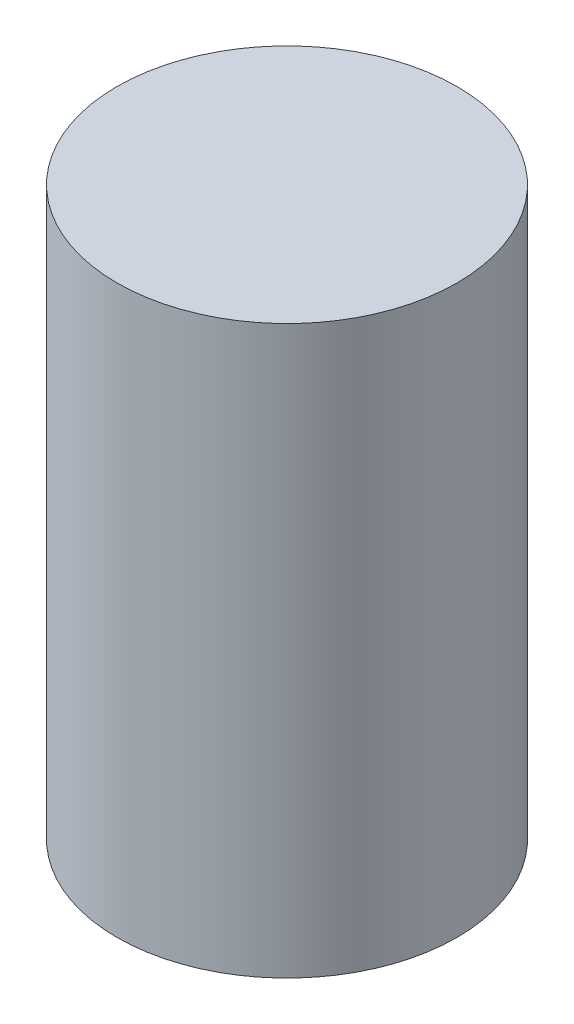
ISO-10303-21;
HEADER;
FILE_DESCRIPTION(('STEP AP214'),'2;1');
FILE_NAME('part.step','',(''),(''),'','','');
FILE_SCHEMA(('AUTOMOTIVE_DESIGN { 1 0 10303 214 1 1 1 1 }'));
ENDSEC;
DATA;
#1=APPLICATION_CONTEXT('core data for automotive mechanical design processes');
#2=APPLICATION_PROTOCOL_DEFINITION('international standard','automotive_design',2000,#1);
#3=PRODUCT_CONTEXT('',#1,'mechanical');
#4=PRODUCT('Part','Part','',(#3));
#5=PRODUCT_RELATED_PRODUCT_CATEGORY('part','',(#4));
#6=PRODUCT_DEFINITION_FORMATION('','',#4);
#7=PRODUCT_DEFINITION_CONTEXT('part definition',#1,'design');
#8=PRODUCT_DEFINITION('design','',#6,#7);
#9=PRODUCT_DEFINITION_SHAPE('','',#8);
#10=(LENGTH_UNIT() NAMED_UNIT(*) SI_UNIT(.MILLI.,.METRE.));
#11=(NAMED_UNIT(*) PLANE_ANGLE_UNIT() SI_UNIT($,.RADIAN.));
#12=(NAMED_UNIT(*) SI_UNIT($,.STERADIAN.) SOLID_ANGLE_UNIT());
#13=UNCERTAINTY_MEASURE_WITH_UNIT(LENGTH_MEASURE(1.E-05),#10,'distance_accuracy_value','');
#14=(GEOMETRIC_REPRESENTATION_CONTEXT(3) GLOBAL_UNCERTAINTY_ASSIGNED_CONTEXT((#13)) GLOBAL_UNIT_ASSIGNED_CONTEXT((#10,
#11,#12)) REPRESENTATION_CONTEXT('',''));
#15=CARTESIAN_POINT('',(0.,0.,0.));
#16=DIRECTION('',(0.,0.,1.));
#17=DIRECTION('',(1.,0.,0.));
#18=AXIS2_PLACEMENT_3D('',#15,#16,#17);
#19=CARTESIAN_POINT('',(0.,3.,0.));
#20=DIRECTION('',(0.,-1.,0.));
#21=DIRECTION('',(0.,0.,-1.));
#22=AXIS2_PLACEMENT_3D('',#19,#20,#21);
#23=CYLINDRICAL_SURFACE('',#22,0.9);
#24=CARTESIAN_POINT('',(0.,3.,0.));
#25=DIRECTION('',(0.,1.,0.));
#26=DIRECTION('',(0.,0.,1.));
#27=AXIS2_PLACEMENT_3D('',#24,#25,#26);
#28=CIRCLE('',#27,0.9);
#29=CARTESIAN_POINT('',(0.,3.,0.9));
#30=VERTEX_POINT('',#29);
#31=EDGE_CURVE('E10',#30,#30,#28,.T.);
#32=ORIENTED_EDGE('',*,*,#31,.F.);
#33=EDGE_LOOP('',(#32));
#34=FACE_BOUND('',#33,.T.);
#35=CARTESIAN_POINT('',(0.,0.,0.));
#36=DIRECTION('',(0.,1.,0.));
#37=DIRECTION('',(0.,0.,1.));
#38=AXIS2_PLACEMENT_3D('',#35,#36,#37);
#39=CIRCLE('',#38,0.9);
#40=CARTESIAN_POINT('',(0.,0.,0.9));
#41=VERTEX_POINT('',#40);
#42=EDGE_CURVE('E40',#41,#41,#39,.T.);
#43=ORIENTED_EDGE('',*,*,#42,.T.);
#44=EDGE_LOOP('',(#43));
#45=FACE_BOUND('',#44,.T.);
#46=ADVANCED_FACE('F37',(#34,#45),#23,.T.);
#47=CARTESIAN_POINT('',(0.,3.,0.));
#48=DIRECTION('',(0.,1.,0.));
#49=DIRECTION('',(0.,0.,1.));
#50=AXIS2_PLACEMENT_3D('',#47,#48,#49);
#51=PLANE('',#50);
#52=ORIENTED_EDGE('',*,*,#31,.T.);
#53=EDGE_LOOP('',(#52));
#54=FACE_BOUND('',#53,.T.);
#55=ADVANCED_FACE('F52',(#54),#51,.T.);
#56=CARTESIAN_POINT('',(0.,0.,0.));
#57=DIRECTION('',(0.,1.,0.));
#58=DIRECTION('',(0.,0.,1.));
#59=AXIS2_PLACEMENT_3D('',#56,#57,#58);
#60=PLANE('',#59);
#61=ORIENTED_EDGE('',*,*,#42,.F.);
#62=EDGE_LOOP('',(#61));
#63=FACE_BOUND('',#62,.T.);
#64=ADVANCED_FACE('F50',(#63),#60,.F.);
#65=CLOSED_SHELL('',(#46,#55,#64));
#66=MANIFOLD_SOLID_BREP('B2',#65);
#67=ADVANCED_BREP_SHAPE_REPRESENTATION('',(#18,#66),#14);
#68=SHAPE_DEFINITION_REPRESENTATION(#9,#67);
ENDSEC;
END-ISO-10303-21;
